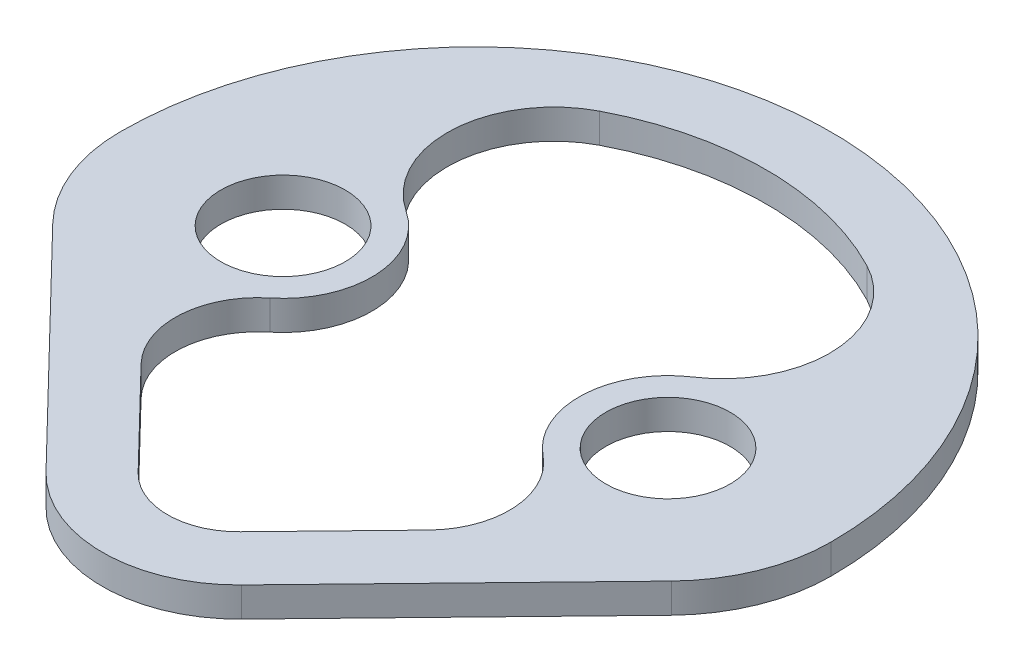
ISO-10303-21;
HEADER;
FILE_DESCRIPTION(('STEP AP214'),'2;1');
FILE_NAME('part.step','',(''),(''),'','','');
FILE_SCHEMA(('AUTOMOTIVE_DESIGN { 1 0 10303 214 1 1 1 1 }'));
ENDSEC;
DATA;
#1=APPLICATION_CONTEXT('core data for automotive mechanical design processes');
#2=APPLICATION_PROTOCOL_DEFINITION('international standard','automotive_design',2000,#1);
#3=PRODUCT_CONTEXT('',#1,'mechanical');
#4=PRODUCT('Part','Part','',(#3));
#5=PRODUCT_RELATED_PRODUCT_CATEGORY('part','',(#4));
#6=PRODUCT_DEFINITION_FORMATION('','',#4);
#7=PRODUCT_DEFINITION_CONTEXT('part definition',#1,'design');
#8=PRODUCT_DEFINITION('design','',#6,#7);
#9=PRODUCT_DEFINITION_SHAPE('','',#8);
#10=(LENGTH_UNIT() NAMED_UNIT(*) SI_UNIT(.MILLI.,.METRE.));
#11=(NAMED_UNIT(*) PLANE_ANGLE_UNIT() SI_UNIT($,.RADIAN.));
#12=(NAMED_UNIT(*) SI_UNIT($,.STERADIAN.) SOLID_ANGLE_UNIT());
#13=UNCERTAINTY_MEASURE_WITH_UNIT(LENGTH_MEASURE(1.E-05),#10,'distance_accuracy_value','');
#14=(GEOMETRIC_REPRESENTATION_CONTEXT(3) GLOBAL_UNCERTAINTY_ASSIGNED_CONTEXT((#13)) GLOBAL_UNIT_ASSIGNED_CONTEXT((#10,
#11,#12)) REPRESENTATION_CONTEXT('',''));
#15=CARTESIAN_POINT('',(0.,0.,0.));
#16=DIRECTION('',(0.,0.,1.));
#17=DIRECTION('',(1.,0.,0.));
#18=AXIS2_PLACEMENT_3D('',#15,#16,#17);
#19=CARTESIAN_POINT('',(32.5,5.,-40.));
#20=DIRECTION('',(0.,-1.,0.));
#21=DIRECTION('',(0.,0.,-1.));
#22=AXIS2_PLACEMENT_3D('',#19,#20,#21);
#23=PLANE('',#22);
#24=CARTESIAN_POINT('',(32.5,5.,-40.));
#25=DIRECTION('',(0.,1.,0.));
#26=DIRECTION('',(0.,0.,1.));
#27=AXIS2_PLACEMENT_3D('',#24,#25,#26);
#28=CIRCLE('',#27,10.5);
#29=CARTESIAN_POINT('',(32.5,5.,-29.5));
#30=VERTEX_POINT('',#29);
#31=EDGE_CURVE('E236',#30,#30,#28,.T.);
#32=ORIENTED_EDGE('',*,*,#31,.F.);
#33=EDGE_LOOP('',(#32));
#34=FACE_BOUND('',#33,.T.);
#35=CARTESIAN_POINT('',(32.5,5.,-40.));
#36=DIRECTION('',(0.,1.,0.));
#37=DIRECTION('',(0.,0.,-1.));
#38=AXIS2_PLACEMENT_3D('',#35,#36,#37);
#39=CIRCLE('',#38,27.5);
#40=CARTESIAN_POINT('',(52.247506700488,5.,-20.8614008058535));
#41=VERTEX_POINT('',#40);
#42=CARTESIAN_POINT('',(60.,5.,-40.));
#43=VERTEX_POINT('',#42);
#44=EDGE_CURVE('E241',#41,#43,#39,.T.);
#45=ORIENTED_EDGE('',*,*,#44,.T.);
#46=CARTESIAN_POINT('',(0.,5.,-40.));
#47=DIRECTION('',(0.,1.,0.));
#48=DIRECTION('',(0.,0.,1.));
#49=AXIS2_PLACEMENT_3D('',#46,#47,#48);
#50=CIRCLE('',#49,60.);
#51=CARTESIAN_POINT('',(-60.,5.,-40.));
#52=VERTEX_POINT('',#51);
#53=EDGE_CURVE('E246',#43,#52,#50,.T.);
#54=ORIENTED_EDGE('',*,*,#53,.T.);
#55=CARTESIAN_POINT('',(-32.5,5.,-40.));
#56=DIRECTION('',(0.,1.,0.));
#57=DIRECTION('',(0.,0.,1.));
#58=AXIS2_PLACEMENT_3D('',#55,#56,#57);
#59=CIRCLE('',#58,27.5);
#60=CARTESIAN_POINT('',(-52.247506700488,5.,-20.8614008058535));
#61=VERTEX_POINT('',#60);
#62=EDGE_CURVE('E252',#52,#61,#59,.T.);
#63=ORIENTED_EDGE('',*,*,#62,.T.);
#64=DIRECTION('',(0.695949061605326,0.,0.718091152745016));
#65=VECTOR('',#64,1.);
#66=CARTESIAN_POINT('',(-16.5160965131354,5.,16.0068284169225));
#67=LINE('',#66,#65);
#68=CARTESIAN_POINT('',(-16.5160965131354,5.,16.0068284169225));
#69=VERTEX_POINT('',#68);
#70=EDGE_CURVE('E253',#61,#69,#67,.T.);
#71=ORIENTED_EDGE('',*,*,#70,.T.);
#72=CARTESIAN_POINT('',(0.,5.,0.));
#73=DIRECTION('',(0.,1.,0.));
#74=DIRECTION('',(0.,0.,-1.));
#75=AXIS2_PLACEMENT_3D('',#72,#73,#74);
#76=CIRCLE('',#75,23.);
#77=CARTESIAN_POINT('',(16.5160965131354,5.,16.0068284169225));
#78=VERTEX_POINT('',#77);
#79=EDGE_CURVE('E251',#69,#78,#76,.T.);
#80=ORIENTED_EDGE('',*,*,#79,.T.);
#81=DIRECTION('',(0.695949061605326,0.,-0.718091152745016));
#82=VECTOR('',#81,1.);
#83=CARTESIAN_POINT('',(16.5160965131354,5.,16.0068284169225));
#84=LINE('',#83,#82);
#85=EDGE_CURVE('E257',#78,#41,#84,.T.);
#86=ORIENTED_EDGE('',*,*,#85,.T.);
#87=EDGE_LOOP('',(#45,#54,#63,#71,#80,#86));
#88=FACE_BOUND('',#87,.T.);
#89=CARTESIAN_POINT('',(14.2807692307692,5.,-17.5185358719739));
#90=DIRECTION('',(0.,1.,0.));
#91=DIRECTION('',(0.,0.,-1.));
#92=AXIS2_PLACEMENT_3D('',#89,#90,#91);
#93=CIRCLE('',#92,13.9371145617909);
#94=CARTESIAN_POINT('',(24.288887892385,5.,-7.81901407120965));
#95=VERTEX_POINT('',#94);
#96=CARTESIAN_POINT('',(23.0557805027556,5.,-28.3463860503332));
#97=VERTEX_POINT('',#96);
#98=EDGE_CURVE('E157',#95,#97,#93,.T.);
#99=ORIENTED_EDGE('',*,*,#98,.F.);
#100=DIRECTION('',(0.695949061605326,0.,-0.718091152745016));
#101=VECTOR('',#100,1.);
#102=CARTESIAN_POINT('',(8.6170938329402,5.,8.35138873926392));
#103=LINE('',#102,#101);
#104=CARTESIAN_POINT('',(8.6170938329402,5.,8.35138873926392));
#105=VERTEX_POINT('',#104);
#106=EDGE_CURVE('E193',#105,#95,#103,.T.);
#107=ORIENTED_EDGE('',*,*,#106,.F.);
#108=CARTESIAN_POINT('',(0.,5.,0.));
#109=DIRECTION('',(0.,1.,0.));
#110=DIRECTION('',(0.,0.,-1.));
#111=AXIS2_PLACEMENT_3D('',#108,#109,#110);
#112=CIRCLE('',#111,12.);
#113=CARTESIAN_POINT('',(-8.6170938329402,5.,8.35138873926392));
#114=VERTEX_POINT('',#113);
#115=EDGE_CURVE('E194',#114,#105,#112,.T.);
#116=ORIENTED_EDGE('',*,*,#115,.F.);
#117=DIRECTION('',(0.695949061605326,0.,0.718091152745016));
#118=VECTOR('',#117,1.);
#119=CARTESIAN_POINT('',(-8.6170938329402,5.,8.35138873926392));
#120=LINE('',#119,#118);
#121=CARTESIAN_POINT('',(-24.288887892385,5.,-7.81901407120966));
#122=VERTEX_POINT('',#121);
#123=EDGE_CURVE('E192',#122,#114,#120,.T.);
#124=ORIENTED_EDGE('',*,*,#123,.F.);
#125=CARTESIAN_POINT('',(-14.2807692307692,5.,-17.5185358719739));
#126=DIRECTION('',(0.,1.,0.));
#127=DIRECTION('',(0.,0.,1.));
#128=AXIS2_PLACEMENT_3D('',#125,#126,#127);
#129=CIRCLE('',#128,13.9371145617909);
#130=CARTESIAN_POINT('',(-23.0557805027555,5.,-28.3463860503332));
#131=VERTEX_POINT('',#130);
#132=EDGE_CURVE('E188',#131,#122,#129,.T.);
#133=ORIENTED_EDGE('',*,*,#132,.F.);
#134=CARTESIAN_POINT('',(-32.5,5.,-40.));
#135=DIRECTION('',(0.,-1.,0.));
#136=DIRECTION('',(0.,0.,1.));
#137=AXIS2_PLACEMENT_3D('',#134,#135,#136);
#138=CIRCLE('',#137,15.);
#139=CARTESIAN_POINT('',(-24.2185314685315,5.,-52.5066893685858));
#140=VERTEX_POINT('',#139);
#141=EDGE_CURVE('E190',#140,#131,#138,.T.);
#142=ORIENTED_EDGE('',*,*,#141,.F.);
#143=CARTESIAN_POINT('',(-14.2807692307692,5.,-67.5147166108887));
#144=DIRECTION('',(0.,1.,0.));
#145=DIRECTION('',(0.,0.,1.));
#146=AXIS2_PLACEMENT_3D('',#143,#144,#145);
#147=CIRCLE('',#146,18.);
#148=CARTESIAN_POINT('',(-22.5728287841191,5.,-83.4910036752757));
#149=VERTEX_POINT('',#148);
#150=EDGE_CURVE('E184',#149,#140,#147,.T.);
#151=ORIENTED_EDGE('',*,*,#150,.F.);
#152=CARTESIAN_POINT('',(0.,5.,-40.));
#153=DIRECTION('',(0.,1.,0.));
#154=DIRECTION('',(0.,0.,1.));
#155=AXIS2_PLACEMENT_3D('',#152,#153,#154);
#156=CIRCLE('',#155,49.);
#157=CARTESIAN_POINT('',(22.5728287841191,5.,-83.4910036752757));
#158=VERTEX_POINT('',#157);
#159=EDGE_CURVE('E179',#158,#149,#156,.T.);
#160=ORIENTED_EDGE('',*,*,#159,.F.);
#161=CARTESIAN_POINT('',(14.2807692307692,5.,-67.5147166108887));
#162=DIRECTION('',(0.,1.,0.));
#163=DIRECTION('',(0.,0.,-1.));
#164=AXIS2_PLACEMENT_3D('',#161,#162,#163);
#165=CIRCLE('',#164,18.);
#166=CARTESIAN_POINT('',(24.2185314685315,5.,-52.5066893685858));
#167=VERTEX_POINT('',#166);
#168=EDGE_CURVE('E178',#167,#158,#165,.T.);
#169=ORIENTED_EDGE('',*,*,#168,.F.);
#170=CARTESIAN_POINT('',(32.5,5.,-40.));
#171=DIRECTION('',(0.,-1.,0.));
#172=DIRECTION('',(0.,0.,-1.));
#173=AXIS2_PLACEMENT_3D('',#170,#171,#172);
#174=CIRCLE('',#173,15.);
#175=EDGE_CURVE('E164',#97,#167,#174,.T.);
#176=ORIENTED_EDGE('',*,*,#175,.F.);
#177=EDGE_LOOP('',(#99,#107,#116,#124,#133,#142,#151,#160,#169,#176));
#178=FACE_BOUND('',#177,.T.);
#179=CARTESIAN_POINT('',(-32.5,5.,-40.));
#180=DIRECTION('',(0.,1.,0.));
#181=DIRECTION('',(0.,0.,-1.));
#182=AXIS2_PLACEMENT_3D('',#179,#180,#181);
#183=CIRCLE('',#182,10.5);
#184=CARTESIAN_POINT('',(-32.5,5.,-50.5));
#185=VERTEX_POINT('',#184);
#186=EDGE_CURVE('E198',#185,#185,#183,.T.);
#187=ORIENTED_EDGE('',*,*,#186,.F.);
#188=EDGE_LOOP('',(#187));
#189=FACE_BOUND('',#188,.T.);
#190=ADVANCED_FACE('F43',(#34,#88,#178,#189),#23,.F.);
#191=CARTESIAN_POINT('',(32.5,0.,-40.));
#192=DIRECTION('',(0.,-1.,0.));
#193=DIRECTION('',(0.,0.,-1.));
#194=AXIS2_PLACEMENT_3D('',#191,#192,#193);
#195=PLANE('',#194);
#196=DIRECTION('',(0.695949061605326,0.,-0.718091152745016));
#197=VECTOR('',#196,1.);
#198=CARTESIAN_POINT('',(8.6170938329402,0.,8.35138873926392));
#199=LINE('',#198,#197);
#200=CARTESIAN_POINT('',(8.6170938329402,0.,8.35138873926392));
#201=VERTEX_POINT('',#200);
#202=CARTESIAN_POINT('',(24.288887892385,0.,-7.81901407120965));
#203=VERTEX_POINT('',#202);
#204=EDGE_CURVE('E161',#201,#203,#199,.T.);
#205=ORIENTED_EDGE('',*,*,#204,.T.);
#206=CARTESIAN_POINT('',(14.2807692307692,0.,-17.5185358719739));
#207=DIRECTION('',(0.,1.,0.));
#208=DIRECTION('',(0.,0.,-1.));
#209=AXIS2_PLACEMENT_3D('',#206,#207,#208);
#210=CIRCLE('',#209,13.9371145617909);
#211=CARTESIAN_POINT('',(23.0557805027556,0.,-28.3463860503332));
#212=VERTEX_POINT('',#211);
#213=EDGE_CURVE('E67',#203,#212,#210,.T.);
#214=ORIENTED_EDGE('',*,*,#213,.T.);
#215=CARTESIAN_POINT('',(32.5,0.,-40.));
#216=DIRECTION('',(0.,-1.,0.));
#217=DIRECTION('',(0.,0.,-1.));
#218=AXIS2_PLACEMENT_3D('',#215,#216,#217);
#219=CIRCLE('',#218,15.);
#220=CARTESIAN_POINT('',(24.2185314685315,0.,-52.5066893685858));
#221=VERTEX_POINT('',#220);
#222=EDGE_CURVE('E173',#212,#221,#219,.T.);
#223=ORIENTED_EDGE('',*,*,#222,.T.);
#224=CARTESIAN_POINT('',(14.2807692307692,0.,-67.5147166108887));
#225=DIRECTION('',(0.,1.,0.));
#226=DIRECTION('',(0.,0.,-1.));
#227=AXIS2_PLACEMENT_3D('',#224,#225,#226);
#228=CIRCLE('',#227,18.);
#229=CARTESIAN_POINT('',(22.5728287841191,0.,-83.4910036752757));
#230=VERTEX_POINT('',#229);
#231=EDGE_CURVE('E196',#221,#230,#228,.T.);
#232=ORIENTED_EDGE('',*,*,#231,.T.);
#233=CARTESIAN_POINT('',(0.,0.,-40.));
#234=DIRECTION('',(0.,1.,0.));
#235=DIRECTION('',(0.,0.,1.));
#236=AXIS2_PLACEMENT_3D('',#233,#234,#235);
#237=CIRCLE('',#236,49.);
#238=CARTESIAN_POINT('',(-22.5728287841191,0.,-83.4910036752757));
#239=VERTEX_POINT('',#238);
#240=EDGE_CURVE('E201',#230,#239,#237,.T.);
#241=ORIENTED_EDGE('',*,*,#240,.T.);
#242=CARTESIAN_POINT('',(-14.2807692307692,0.,-67.5147166108887));
#243=DIRECTION('',(0.,1.,0.));
#244=DIRECTION('',(0.,0.,1.));
#245=AXIS2_PLACEMENT_3D('',#242,#243,#244);
#246=CIRCLE('',#245,18.);
#247=CARTESIAN_POINT('',(-24.2185314685315,0.,-52.5066893685858));
#248=VERTEX_POINT('',#247);
#249=EDGE_CURVE('E207',#239,#248,#246,.T.);
#250=ORIENTED_EDGE('',*,*,#249,.T.);
#251=CARTESIAN_POINT('',(-32.5,0.,-40.));
#252=DIRECTION('',(0.,-1.,0.));
#253=DIRECTION('',(0.,0.,1.));
#254=AXIS2_PLACEMENT_3D('',#251,#252,#253);
#255=CIRCLE('',#254,15.);
#256=CARTESIAN_POINT('',(-23.0557805027555,0.,-28.3463860503332));
#257=VERTEX_POINT('',#256);
#258=EDGE_CURVE('E209',#248,#257,#255,.T.);
#259=ORIENTED_EDGE('',*,*,#258,.T.);
#260=CARTESIAN_POINT('',(-14.2807692307692,0.,-17.5185358719739));
#261=DIRECTION('',(0.,1.,0.));
#262=DIRECTION('',(0.,0.,1.));
#263=AXIS2_PLACEMENT_3D('',#260,#261,#262);
#264=CIRCLE('',#263,13.9371145617909);
#265=CARTESIAN_POINT('',(-24.288887892385,0.,-7.81901407120966));
#266=VERTEX_POINT('',#265);
#267=EDGE_CURVE('E212',#257,#266,#264,.T.);
#268=ORIENTED_EDGE('',*,*,#267,.T.);
#269=DIRECTION('',(0.695949061605326,0.,0.718091152745016));
#270=VECTOR('',#269,1.);
#271=CARTESIAN_POINT('',(-8.6170938329402,0.,8.35138873926392));
#272=LINE('',#271,#270);
#273=CARTESIAN_POINT('',(-8.6170938329402,0.,8.35138873926392));
#274=VERTEX_POINT('',#273);
#275=EDGE_CURVE('E214',#266,#274,#272,.T.);
#276=ORIENTED_EDGE('',*,*,#275,.T.);
#277=CARTESIAN_POINT('',(0.,0.,0.));
#278=DIRECTION('',(0.,1.,0.));
#279=DIRECTION('',(0.,0.,1.));
#280=AXIS2_PLACEMENT_3D('',#277,#278,#279);
#281=CIRCLE('',#280,12.);
#282=EDGE_CURVE('E216',#274,#201,#281,.T.);
#283=ORIENTED_EDGE('',*,*,#282,.T.);
#284=EDGE_LOOP('',(#205,#214,#223,#232,#241,#250,#259,#268,#276,#283));
#285=FACE_BOUND('',#284,.T.);
#286=CARTESIAN_POINT('',(32.5,0.,-40.));
#287=DIRECTION('',(0.,1.,0.));
#288=DIRECTION('',(0.,0.,1.));
#289=AXIS2_PLACEMENT_3D('',#286,#287,#288);
#290=CIRCLE('',#289,10.5);
#291=CARTESIAN_POINT('',(32.5,0.,-29.5));
#292=VERTEX_POINT('',#291);
#293=EDGE_CURVE('E175',#292,#292,#290,.T.);
#294=ORIENTED_EDGE('',*,*,#293,.T.);
#295=EDGE_LOOP('',(#294));
#296=FACE_BOUND('',#295,.T.);
#297=CARTESIAN_POINT('',(32.5,0.,-40.));
#298=DIRECTION('',(0.,1.,0.));
#299=DIRECTION('',(0.,0.,-1.));
#300=AXIS2_PLACEMENT_3D('',#297,#298,#299);
#301=CIRCLE('',#300,27.5);
#302=CARTESIAN_POINT('',(52.247506700488,0.,-20.8614008058535));
#303=VERTEX_POINT('',#302);
#304=CARTESIAN_POINT('',(60.,0.,-40.));
#305=VERTEX_POINT('',#304);
#306=EDGE_CURVE('E245',#303,#305,#301,.T.);
#307=ORIENTED_EDGE('',*,*,#306,.F.);
#308=DIRECTION('',(0.695949061605326,0.,-0.718091152745016));
#309=VECTOR('',#308,1.);
#310=CARTESIAN_POINT('',(16.5160965131354,0.,16.0068284169225));
#311=LINE('',#310,#309);
#312=CARTESIAN_POINT('',(16.5160965131354,0.,16.0068284169225));
#313=VERTEX_POINT('',#312);
#314=EDGE_CURVE('E249',#313,#303,#311,.T.);
#315=ORIENTED_EDGE('',*,*,#314,.F.);
#316=CARTESIAN_POINT('',(0.,0.,0.));
#317=DIRECTION('',(0.,1.,0.));
#318=DIRECTION('',(0.,0.,1.));
#319=AXIS2_PLACEMENT_3D('',#316,#317,#318);
#320=CIRCLE('',#319,23.);
#321=CARTESIAN_POINT('',(-16.5160965131354,0.,16.0068284169225));
#322=VERTEX_POINT('',#321);
#323=EDGE_CURVE('E267',#322,#313,#320,.T.);
#324=ORIENTED_EDGE('',*,*,#323,.F.);
#325=DIRECTION('',(0.695949061605326,0.,0.718091152745016));
#326=VECTOR('',#325,1.);
#327=CARTESIAN_POINT('',(-16.5160965131354,0.,16.0068284169225));
#328=LINE('',#327,#326);
#329=CARTESIAN_POINT('',(-52.247506700488,0.,-20.8614008058535));
#330=VERTEX_POINT('',#329);
#331=EDGE_CURVE('E266',#330,#322,#328,.T.);
#332=ORIENTED_EDGE('',*,*,#331,.F.);
#333=CARTESIAN_POINT('',(-32.5,0.,-40.));
#334=DIRECTION('',(0.,1.,0.));
#335=DIRECTION('',(0.,0.,1.));
#336=AXIS2_PLACEMENT_3D('',#333,#334,#335);
#337=CIRCLE('',#336,27.5);
#338=CARTESIAN_POINT('',(-60.,0.,-40.));
#339=VERTEX_POINT('',#338);
#340=EDGE_CURVE('E264',#339,#330,#337,.T.);
#341=ORIENTED_EDGE('',*,*,#340,.F.);
#342=CARTESIAN_POINT('',(0.,0.,-40.));
#343=DIRECTION('',(0.,1.,0.));
#344=DIRECTION('',(0.,0.,-1.));
#345=AXIS2_PLACEMENT_3D('',#342,#343,#344);
#346=CIRCLE('',#345,60.);
#347=EDGE_CURVE('E265',#305,#339,#346,.T.);
#348=ORIENTED_EDGE('',*,*,#347,.F.);
#349=EDGE_LOOP('',(#307,#315,#324,#332,#341,#348));
#350=FACE_BOUND('',#349,.T.);
#351=CARTESIAN_POINT('',(-32.5,0.,-40.));
#352=DIRECTION('',(0.,1.,0.));
#353=DIRECTION('',(0.,0.,-1.));
#354=AXIS2_PLACEMENT_3D('',#351,#352,#353);
#355=CIRCLE('',#354,10.5);
#356=CARTESIAN_POINT('',(-32.5,0.,-50.5));
#357=VERTEX_POINT('',#356);
#358=EDGE_CURVE('E378',#357,#357,#355,.T.);
#359=ORIENTED_EDGE('',*,*,#358,.T.);
#360=EDGE_LOOP('',(#359));
#361=FACE_BOUND('',#360,.T.);
#362=ADVANCED_FACE('F291',(#285,#296,#350,#361),#195,.T.);
#363=CARTESIAN_POINT('',(32.5,5.,-40.));
#364=DIRECTION('',(0.,-1.,0.));
#365=DIRECTION('',(0.,0.,-1.));
#366=AXIS2_PLACEMENT_3D('',#363,#364,#365);
#367=CYLINDRICAL_SURFACE('',#366,27.5);
#368=ORIENTED_EDGE('',*,*,#306,.T.);
#369=DIRECTION('',(0.,-1.,0.));
#370=VECTOR('',#369,1.);
#371=CARTESIAN_POINT('',(60.,5.,-40.));
#372=LINE('',#371,#370);
#373=EDGE_CURVE('E11',#43,#305,#372,.T.);
#374=ORIENTED_EDGE('',*,*,#373,.F.);
#375=ORIENTED_EDGE('',*,*,#44,.F.);
#376=DIRECTION('',(0.,-1.,0.));
#377=VECTOR('',#376,1.);
#378=CARTESIAN_POINT('',(52.247506700488,5.,-20.8614008058535));
#379=LINE('',#378,#377);
#380=EDGE_CURVE('E260',#41,#303,#379,.T.);
#381=ORIENTED_EDGE('',*,*,#380,.T.);
#382=EDGE_LOOP('',(#368,#374,#375,#381));
#383=FACE_BOUND('',#382,.T.);
#384=ADVANCED_FACE('F44',(#383),#367,.T.);
#385=CARTESIAN_POINT('',(0.,5.,-40.));
#386=DIRECTION('',(0.,-1.,0.));
#387=DIRECTION('',(0.,0.,-1.));
#388=AXIS2_PLACEMENT_3D('',#385,#386,#387);
#389=CYLINDRICAL_SURFACE('',#388,60.);
#390=ORIENTED_EDGE('',*,*,#347,.T.);
#391=DIRECTION('',(0.,-1.,0.));
#392=VECTOR('',#391,1.);
#393=CARTESIAN_POINT('',(-60.,5.,-40.));
#394=LINE('',#393,#392);
#395=EDGE_CURVE('E51',#52,#339,#394,.T.);
#396=ORIENTED_EDGE('',*,*,#395,.F.);
#397=ORIENTED_EDGE('',*,*,#53,.F.);
#398=ORIENTED_EDGE('',*,*,#373,.T.);
#399=EDGE_LOOP('',(#390,#396,#397,#398));
#400=FACE_BOUND('',#399,.T.);
#401=ADVANCED_FACE('F309',(#400),#389,.T.);
#402=CARTESIAN_POINT('',(-32.5,5.,-40.));
#403=DIRECTION('',(0.,-1.,0.));
#404=DIRECTION('',(0.,0.,-1.));
#405=AXIS2_PLACEMENT_3D('',#402,#403,#404);
#406=CYLINDRICAL_SURFACE('',#405,27.5);
#407=ORIENTED_EDGE('',*,*,#340,.T.);
#408=DIRECTION('',(0.,-1.,0.));
#409=VECTOR('',#408,1.);
#410=CARTESIAN_POINT('',(-52.247506700488,5.,-20.8614008058535));
#411=LINE('',#410,#409);
#412=EDGE_CURVE('E279',#61,#330,#411,.T.);
#413=ORIENTED_EDGE('',*,*,#412,.F.);
#414=ORIENTED_EDGE('',*,*,#62,.F.);
#415=ORIENTED_EDGE('',*,*,#395,.T.);
#416=EDGE_LOOP('',(#407,#413,#414,#415));
#417=FACE_BOUND('',#416,.T.);
#418=ADVANCED_FACE('F290',(#417),#406,.T.);
#419=CARTESIAN_POINT('',(-16.5160965131354,5.,16.0068284169225));
#420=DIRECTION('',(0.718091152745016,0.,-0.695949061605326));
#421=DIRECTION('',(-0.695949061605326,0.,-0.718091152745016));
#422=AXIS2_PLACEMENT_3D('',#419,#420,#421);
#423=PLANE('',#422);
#424=ORIENTED_EDGE('',*,*,#331,.T.);
#425=DIRECTION('',(0.,-1.,0.));
#426=VECTOR('',#425,1.);
#427=CARTESIAN_POINT('',(-16.5160965131354,5.,16.0068284169225));
#428=LINE('',#427,#426);
#429=EDGE_CURVE('E280',#69,#322,#428,.T.);
#430=ORIENTED_EDGE('',*,*,#429,.F.);
#431=ORIENTED_EDGE('',*,*,#70,.F.);
#432=ORIENTED_EDGE('',*,*,#412,.T.);
#433=EDGE_LOOP('',(#424,#430,#431,#432));
#434=FACE_BOUND('',#433,.T.);
#435=ADVANCED_FACE('F298',(#434),#423,.F.);
#436=CARTESIAN_POINT('',(0.,5.,0.));
#437=DIRECTION('',(0.,-1.,0.));
#438=DIRECTION('',(0.,0.,-1.));
#439=AXIS2_PLACEMENT_3D('',#436,#437,#438);
#440=CYLINDRICAL_SURFACE('',#439,23.);
#441=ORIENTED_EDGE('',*,*,#323,.T.);
#442=DIRECTION('',(0.,-1.,0.));
#443=VECTOR('',#442,1.);
#444=CARTESIAN_POINT('',(16.5160965131354,5.,16.0068284169225));
#445=LINE('',#444,#443);
#446=EDGE_CURVE('E272',#78,#313,#445,.T.);
#447=ORIENTED_EDGE('',*,*,#446,.F.);
#448=ORIENTED_EDGE('',*,*,#79,.F.);
#449=ORIENTED_EDGE('',*,*,#429,.T.);
#450=EDGE_LOOP('',(#441,#447,#448,#449));
#451=FACE_BOUND('',#450,.T.);
#452=ADVANCED_FACE('F302',(#451),#440,.T.);
#453=CARTESIAN_POINT('',(16.5160965131354,5.,16.0068284169225));
#454=DIRECTION('',(-0.718091152745016,0.,-0.695949061605326));
#455=DIRECTION('',(-0.695949061605326,0.,0.718091152745016));
#456=AXIS2_PLACEMENT_3D('',#453,#454,#455);
#457=PLANE('',#456);
#458=ORIENTED_EDGE('',*,*,#314,.T.);
#459=ORIENTED_EDGE('',*,*,#380,.F.);
#460=ORIENTED_EDGE('',*,*,#85,.F.);
#461=ORIENTED_EDGE('',*,*,#446,.T.);
#462=EDGE_LOOP('',(#458,#459,#460,#461));
#463=FACE_BOUND('',#462,.T.);
#464=ADVANCED_FACE('F315',(#463),#457,.F.);
#465=CARTESIAN_POINT('',(32.5,5.,-40.));
#466=DIRECTION('',(0.,-1.,0.));
#467=DIRECTION('',(0.,0.,-1.));
#468=AXIS2_PLACEMENT_3D('',#465,#466,#467);
#469=CYLINDRICAL_SURFACE('',#468,10.5);
#470=ORIENTED_EDGE('',*,*,#31,.T.);
#471=EDGE_LOOP('',(#470));
#472=FACE_BOUND('',#471,.T.);
#473=ORIENTED_EDGE('',*,*,#293,.F.);
#474=EDGE_LOOP('',(#473));
#475=FACE_BOUND('',#474,.T.);
#476=ADVANCED_FACE('F312',(#472,#475),#469,.F.);
#477=CARTESIAN_POINT('',(14.2807692307692,5.,-17.5185358719739));
#478=DIRECTION('',(0.,-1.,0.));
#479=DIRECTION('',(0.,0.,-1.));
#480=AXIS2_PLACEMENT_3D('',#477,#478,#479);
#481=CYLINDRICAL_SURFACE('',#480,13.9371145617909);
#482=ORIENTED_EDGE('',*,*,#213,.F.);
#483=DIRECTION('',(0.,-1.,0.));
#484=VECTOR('',#483,1.);
#485=CARTESIAN_POINT('',(24.288887892385,5.,-7.81901407120965));
#486=LINE('',#485,#484);
#487=EDGE_CURVE('E158',#95,#203,#486,.T.);
#488=ORIENTED_EDGE('',*,*,#487,.F.);
#489=ORIENTED_EDGE('',*,*,#98,.T.);
#490=DIRECTION('',(0.,-1.,0.));
#491=VECTOR('',#490,1.);
#492=CARTESIAN_POINT('',(23.0557805027556,5.,-28.3463860503332));
#493=LINE('',#492,#491);
#494=EDGE_CURVE('E159',#97,#212,#493,.T.);
#495=ORIENTED_EDGE('',*,*,#494,.T.);
#496=EDGE_LOOP('',(#482,#488,#489,#495));
#497=FACE_BOUND('',#496,.T.);
#498=ADVANCED_FACE('F156',(#497),#481,.F.);
#499=CARTESIAN_POINT('',(32.5,5.,-40.));
#500=DIRECTION('',(0.,-1.,0.));
#501=DIRECTION('',(0.,0.,-1.));
#502=AXIS2_PLACEMENT_3D('',#499,#500,#501);
#503=CYLINDRICAL_SURFACE('',#502,15.);
#504=ORIENTED_EDGE('',*,*,#222,.F.);
#505=ORIENTED_EDGE('',*,*,#494,.F.);
#506=ORIENTED_EDGE('',*,*,#175,.T.);
#507=DIRECTION('',(0.,-1.,0.));
#508=VECTOR('',#507,1.);
#509=CARTESIAN_POINT('',(24.2185314685315,5.,-52.5066893685858));
#510=LINE('',#509,#508);
#511=EDGE_CURVE('E171',#167,#221,#510,.T.);
#512=ORIENTED_EDGE('',*,*,#511,.T.);
#513=EDGE_LOOP('',(#504,#505,#506,#512));
#514=FACE_BOUND('',#513,.T.);
#515=ADVANCED_FACE('F166',(#514),#503,.T.);
#516=CARTESIAN_POINT('',(14.2807692307692,5.,-67.5147166108887));
#517=DIRECTION('',(0.,-1.,0.));
#518=DIRECTION('',(0.,0.,-1.));
#519=AXIS2_PLACEMENT_3D('',#516,#517,#518);
#520=CYLINDRICAL_SURFACE('',#519,18.);
#521=ORIENTED_EDGE('',*,*,#231,.F.);
#522=ORIENTED_EDGE('',*,*,#511,.F.);
#523=ORIENTED_EDGE('',*,*,#168,.T.);
#524=DIRECTION('',(0.,-1.,0.));
#525=VECTOR('',#524,1.);
#526=CARTESIAN_POINT('',(22.5728287841191,5.,-83.4910036752757));
#527=LINE('',#526,#525);
#528=EDGE_CURVE('E237',#158,#230,#527,.T.);
#529=ORIENTED_EDGE('',*,*,#528,.T.);
#530=EDGE_LOOP('',(#521,#522,#523,#529));
#531=FACE_BOUND('',#530,.T.);
#532=ADVANCED_FACE('F340',(#531),#520,.F.);
#533=CARTESIAN_POINT('',(0.,5.,-40.));
#534=DIRECTION('',(0.,-1.,0.));
#535=DIRECTION('',(0.,0.,-1.));
#536=AXIS2_PLACEMENT_3D('',#533,#534,#535);
#537=CYLINDRICAL_SURFACE('',#536,49.);
#538=ORIENTED_EDGE('',*,*,#240,.F.);
#539=ORIENTED_EDGE('',*,*,#528,.F.);
#540=ORIENTED_EDGE('',*,*,#159,.T.);
#541=DIRECTION('',(0.,-1.,0.));
#542=VECTOR('',#541,1.);
#543=CARTESIAN_POINT('',(-22.5728287841191,5.,-83.4910036752757));
#544=LINE('',#543,#542);
#545=EDGE_CURVE('E233',#149,#239,#544,.T.);
#546=ORIENTED_EDGE('',*,*,#545,.T.);
#547=EDGE_LOOP('',(#538,#539,#540,#546));
#548=FACE_BOUND('',#547,.T.);
#549=ADVANCED_FACE('F338',(#548),#537,.F.);
#550=CARTESIAN_POINT('',(-14.2807692307692,5.,-67.5147166108887));
#551=DIRECTION('',(0.,-1.,0.));
#552=DIRECTION('',(0.,0.,-1.));
#553=AXIS2_PLACEMENT_3D('',#550,#551,#552);
#554=CYLINDRICAL_SURFACE('',#553,18.);
#555=ORIENTED_EDGE('',*,*,#249,.F.);
#556=ORIENTED_EDGE('',*,*,#545,.F.);
#557=ORIENTED_EDGE('',*,*,#150,.T.);
#558=DIRECTION('',(0.,-1.,0.));
#559=VECTOR('',#558,1.);
#560=CARTESIAN_POINT('',(-24.2185314685315,5.,-52.5066893685858));
#561=LINE('',#560,#559);
#562=EDGE_CURVE('E235',#140,#248,#561,.T.);
#563=ORIENTED_EDGE('',*,*,#562,.T.);
#564=EDGE_LOOP('',(#555,#556,#557,#563));
#565=FACE_BOUND('',#564,.T.);
#566=ADVANCED_FACE('F344',(#565),#554,.F.);
#567=CARTESIAN_POINT('',(-32.5,5.,-40.));
#568=DIRECTION('',(0.,-1.,0.));
#569=DIRECTION('',(0.,0.,-1.));
#570=AXIS2_PLACEMENT_3D('',#567,#568,#569);
#571=CYLINDRICAL_SURFACE('',#570,15.);
#572=ORIENTED_EDGE('',*,*,#258,.F.);
#573=ORIENTED_EDGE('',*,*,#562,.F.);
#574=ORIENTED_EDGE('',*,*,#141,.T.);
#575=DIRECTION('',(0.,-1.,0.));
#576=VECTOR('',#575,1.);
#577=CARTESIAN_POINT('',(-23.0557805027555,5.,-28.3463860503332));
#578=LINE('',#577,#576);
#579=EDGE_CURVE('E229',#131,#257,#578,.T.);
#580=ORIENTED_EDGE('',*,*,#579,.T.);
#581=EDGE_LOOP('',(#572,#573,#574,#580));
#582=FACE_BOUND('',#581,.T.);
#583=ADVANCED_FACE('F346',(#582),#571,.T.);
#584=CARTESIAN_POINT('',(-14.2807692307692,5.,-17.5185358719739));
#585=DIRECTION('',(0.,-1.,0.));
#586=DIRECTION('',(0.,0.,-1.));
#587=AXIS2_PLACEMENT_3D('',#584,#585,#586);
#588=CYLINDRICAL_SURFACE('',#587,13.9371145617909);
#589=ORIENTED_EDGE('',*,*,#267,.F.);
#590=ORIENTED_EDGE('',*,*,#579,.F.);
#591=ORIENTED_EDGE('',*,*,#132,.T.);
#592=DIRECTION('',(0.,-1.,0.));
#593=VECTOR('',#592,1.);
#594=CARTESIAN_POINT('',(-24.288887892385,5.,-7.81901407120966));
#595=LINE('',#594,#593);
#596=EDGE_CURVE('E228',#122,#266,#595,.T.);
#597=ORIENTED_EDGE('',*,*,#596,.T.);
#598=EDGE_LOOP('',(#589,#590,#591,#597));
#599=FACE_BOUND('',#598,.T.);
#600=ADVANCED_FACE('F355',(#599),#588,.F.);
#601=CARTESIAN_POINT('',(-8.6170938329402,5.,8.35138873926392));
#602=DIRECTION('',(0.718091152745016,0.,-0.695949061605326));
#603=DIRECTION('',(-0.695949061605326,0.,-0.718091152745016));
#604=AXIS2_PLACEMENT_3D('',#601,#602,#603);
#605=PLANE('',#604);
#606=ORIENTED_EDGE('',*,*,#275,.F.);
#607=ORIENTED_EDGE('',*,*,#596,.F.);
#608=ORIENTED_EDGE('',*,*,#123,.T.);
#609=DIRECTION('',(0.,-1.,0.));
#610=VECTOR('',#609,1.);
#611=CARTESIAN_POINT('',(-8.6170938329402,5.,8.35138873926392));
#612=LINE('',#611,#610);
#613=EDGE_CURVE('E224',#114,#274,#612,.T.);
#614=ORIENTED_EDGE('',*,*,#613,.T.);
#615=EDGE_LOOP('',(#606,#607,#608,#614));
#616=FACE_BOUND('',#615,.T.);
#617=ADVANCED_FACE('F356',(#616),#605,.T.);
#618=CARTESIAN_POINT('',(0.,5.,0.));
#619=DIRECTION('',(0.,-1.,0.));
#620=DIRECTION('',(0.,0.,-1.));
#621=AXIS2_PLACEMENT_3D('',#618,#619,#620);
#622=CYLINDRICAL_SURFACE('',#621,12.);
#623=ORIENTED_EDGE('',*,*,#282,.F.);
#624=ORIENTED_EDGE('',*,*,#613,.F.);
#625=ORIENTED_EDGE('',*,*,#115,.T.);
#626=DIRECTION('',(0.,-1.,0.));
#627=VECTOR('',#626,1.);
#628=CARTESIAN_POINT('',(8.6170938329402,5.,8.35138873926392));
#629=LINE('',#628,#627);
#630=EDGE_CURVE('E59',#105,#201,#629,.T.);
#631=ORIENTED_EDGE('',*,*,#630,.T.);
#632=EDGE_LOOP('',(#623,#624,#625,#631));
#633=FACE_BOUND('',#632,.T.);
#634=ADVANCED_FACE('F359',(#633),#622,.F.);
#635=CARTESIAN_POINT('',(8.6170938329402,5.,8.35138873926392));
#636=DIRECTION('',(-0.718091152745016,0.,-0.695949061605326));
#637=DIRECTION('',(-0.695949061605326,0.,0.718091152745016));
#638=AXIS2_PLACEMENT_3D('',#635,#636,#637);
#639=PLANE('',#638);
#640=ORIENTED_EDGE('',*,*,#204,.F.);
#641=ORIENTED_EDGE('',*,*,#630,.F.);
#642=ORIENTED_EDGE('',*,*,#106,.T.);
#643=ORIENTED_EDGE('',*,*,#487,.T.);
#644=EDGE_LOOP('',(#640,#641,#642,#643));
#645=FACE_BOUND('',#644,.T.);
#646=ADVANCED_FACE('F362',(#645),#639,.T.);
#647=CARTESIAN_POINT('',(-32.5,5.,-40.));
#648=DIRECTION('',(0.,-1.,0.));
#649=DIRECTION('',(0.,0.,-1.));
#650=AXIS2_PLACEMENT_3D('',#647,#648,#649);
#651=CYLINDRICAL_SURFACE('',#650,10.5);
#652=ORIENTED_EDGE('',*,*,#186,.T.);
#653=EDGE_LOOP('',(#652));
#654=FACE_BOUND('',#653,.T.);
#655=ORIENTED_EDGE('',*,*,#358,.F.);
#656=EDGE_LOOP('',(#655));
#657=FACE_BOUND('',#656,.T.);
#658=ADVANCED_FACE('F367',(#654,#657),#651,.F.);
#659=CLOSED_SHELL('',(#190,#362,#384,#401,#418,#435,#452,#464,#476,#498,#515,#532,#549,#566,
#583,#600,#617,#634,#646,#658));
#660=MANIFOLD_SOLID_BREP('B2',#659);
#661=ADVANCED_BREP_SHAPE_REPRESENTATION('',(#18,#660),#14);
#662=SHAPE_DEFINITION_REPRESENTATION(#9,#661);
ENDSEC;
END-ISO-10303-21;
